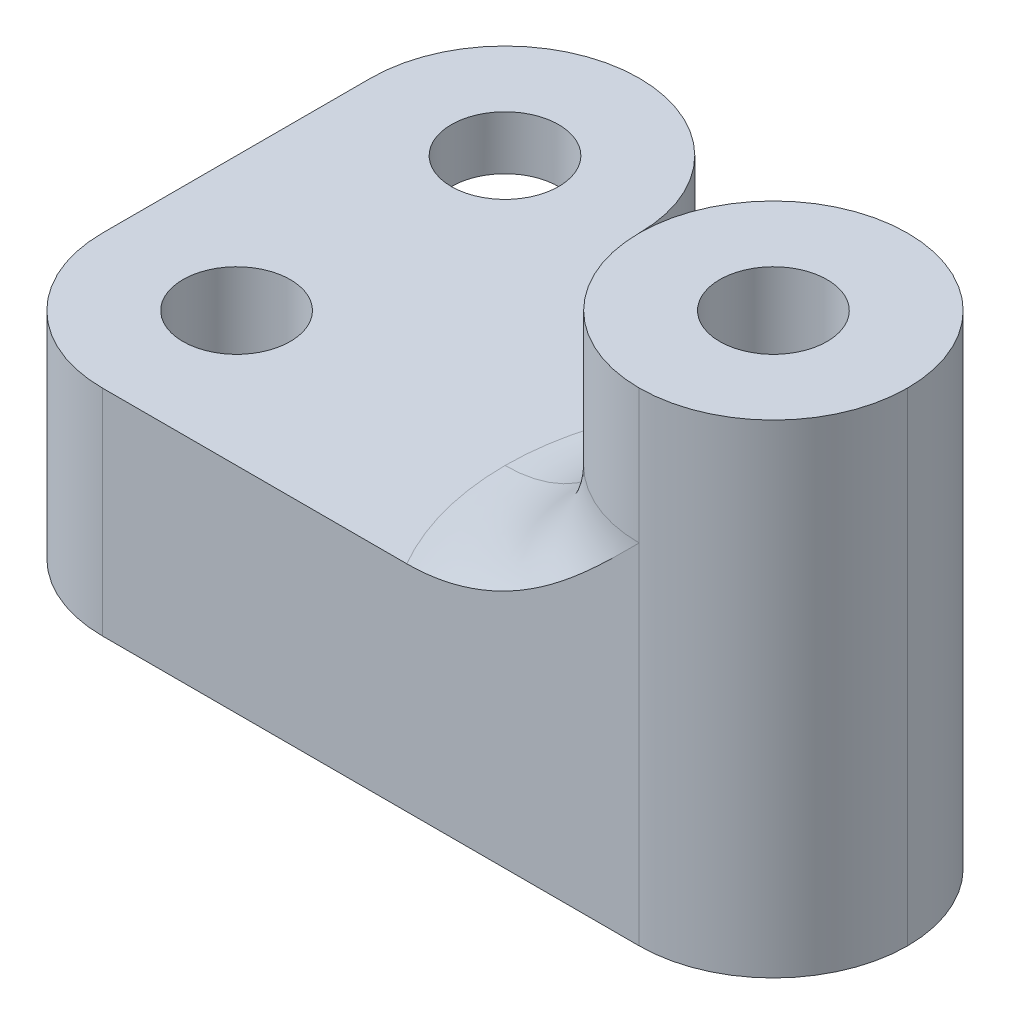
ISO-10303-21;
HEADER;
FILE_DESCRIPTION(('STEP AP214'),'2;1');
FILE_NAME('part.step','',(''),(''),'','','');
FILE_SCHEMA(('AUTOMOTIVE_DESIGN { 1 0 10303 214 1 1 1 1 }'));
ENDSEC;
DATA;
#1=APPLICATION_CONTEXT('core data for automotive mechanical design processes');
#2=APPLICATION_PROTOCOL_DEFINITION('international standard','automotive_design',2000,#1);
#3=PRODUCT_CONTEXT('',#1,'mechanical');
#4=PRODUCT('Part','Part','',(#3));
#5=PRODUCT_RELATED_PRODUCT_CATEGORY('part','',(#4));
#6=PRODUCT_DEFINITION_FORMATION('','',#4);
#7=PRODUCT_DEFINITION_CONTEXT('part definition',#1,'design');
#8=PRODUCT_DEFINITION('design','',#6,#7);
#9=PRODUCT_DEFINITION_SHAPE('','',#8);
#10=(LENGTH_UNIT() NAMED_UNIT(*) SI_UNIT(.MILLI.,.METRE.));
#11=(NAMED_UNIT(*) PLANE_ANGLE_UNIT() SI_UNIT($,.RADIAN.));
#12=(NAMED_UNIT(*) SI_UNIT($,.STERADIAN.) SOLID_ANGLE_UNIT());
#13=UNCERTAINTY_MEASURE_WITH_UNIT(LENGTH_MEASURE(1.E-05),#10,'distance_accuracy_value','');
#14=(GEOMETRIC_REPRESENTATION_CONTEXT(3) GLOBAL_UNCERTAINTY_ASSIGNED_CONTEXT((#13)) GLOBAL_UNIT_ASSIGNED_CONTEXT((#10,
#11,#12)) REPRESENTATION_CONTEXT('',''));
#15=CARTESIAN_POINT('',(0.,0.,0.));
#16=DIRECTION('',(0.,0.,1.));
#17=DIRECTION('',(1.,0.,0.));
#18=AXIS2_PLACEMENT_3D('',#15,#16,#17);
#19=CARTESIAN_POINT('',(2.5,-1.,-7.5));
#20=DIRECTION('',(0.,1.,0.));
#21=DIRECTION('',(0.,0.,1.));
#22=AXIS2_PLACEMENT_3D('',#19,#20,#21);
#23=CYLINDRICAL_SURFACE('',#22,1.);
#24=CARTESIAN_POINT('',(2.5,3.,-7.5));
#25=DIRECTION('',(0.,1.,0.));
#26=DIRECTION('',(-1.,0.,0.));
#27=AXIS2_PLACEMENT_3D('',#24,#25,#26);
#28=CIRCLE('',#27,1.);
#29=CARTESIAN_POINT('',(1.5,3.,-7.5));
#30=VERTEX_POINT('',#29);
#31=EDGE_CURVE('E208',#30,#30,#28,.F.);
#32=ORIENTED_EDGE('',*,*,#31,.T.);
#33=EDGE_LOOP('',(#32));
#34=FACE_BOUND('',#33,.T.);
#35=CARTESIAN_POINT('',(2.5,4.,-7.5));
#36=DIRECTION('',(0.,1.,0.));
#37=DIRECTION('',(0.,0.,1.));
#38=AXIS2_PLACEMENT_3D('',#35,#36,#37);
#39=CIRCLE('',#38,1.);
#40=CARTESIAN_POINT('',(2.5,4.,-6.5));
#41=VERTEX_POINT('',#40);
#42=EDGE_CURVE('E217',#41,#41,#39,.T.);
#43=ORIENTED_EDGE('',*,*,#42,.T.);
#44=EDGE_LOOP('',(#43));
#45=FACE_BOUND('',#44,.T.);
#46=ADVANCED_FACE('F44',(#34,#45),#23,.F.);
#47=CARTESIAN_POINT('',(0.,4.,0.));
#48=DIRECTION('',(0.,-1.,0.));
#49=DIRECTION('',(0.,0.,-1.));
#50=AXIS2_PLACEMENT_3D('',#47,#48,#49);
#51=PLANE('',#50);
#52=CARTESIAN_POINT('',(2.5,4.,-2.5));
#53=DIRECTION('',(0.,1.,0.));
#54=DIRECTION('',(0.,0.,1.));
#55=AXIS2_PLACEMENT_3D('',#52,#53,#54);
#56=CIRCLE('',#55,1.);
#57=CARTESIAN_POINT('',(2.5,4.,-1.5));
#58=VERTEX_POINT('',#57);
#59=EDGE_CURVE('E216',#58,#58,#56,.T.);
#60=ORIENTED_EDGE('',*,*,#59,.F.);
#61=EDGE_LOOP('',(#60));
#62=FACE_BOUND('',#61,.T.);
#63=ORIENTED_EDGE('',*,*,#42,.F.);
#64=EDGE_LOOP('',(#63));
#65=FACE_BOUND('',#64,.T.);
#66=CARTESIAN_POINT('',(12.5,4.,-2.5));
#67=DIRECTION('',(0.,-1.,0.));
#68=DIRECTION('',(0.,0.,-1.));
#69=AXIS2_PLACEMENT_3D('',#66,#67,#68);
#70=CIRCLE('',#69,5.);
#71=CARTESIAN_POINT('',(8.16987298107781,4.,0.));
#72=VERTEX_POINT('',#71);
#73=CARTESIAN_POINT('',(7.5,4.,-2.5));
#74=VERTEX_POINT('',#73);
#75=EDGE_CURVE('E343',#72,#74,#70,.T.);
#76=ORIENTED_EDGE('',*,*,#75,.T.);
#77=CARTESIAN_POINT('',(12.5,4.,-2.5));
#78=DIRECTION('',(0.,-1.,0.));
#79=DIRECTION('',(0.,0.,-1.));
#80=AXIS2_PLACEMENT_3D('',#77,#78,#79);
#81=CIRCLE('',#80,5.);
#82=CARTESIAN_POINT('',(8.16987298107781,4.,-5.));
#83=VERTEX_POINT('',#82);
#84=EDGE_CURVE('E375',#74,#83,#81,.T.);
#85=ORIENTED_EDGE('',*,*,#84,.T.);
#86=DIRECTION('',(-1.,0.,0.));
#87=VECTOR('',#86,1.);
#88=CARTESIAN_POINT('',(5.,4.,-5.));
#89=LINE('',#88,#87);
#90=CARTESIAN_POINT('',(7.5,4.,-5.));
#91=VERTEX_POINT('',#90);
#92=EDGE_CURVE('E229',#83,#91,#89,.T.);
#93=ORIENTED_EDGE('',*,*,#92,.T.);
#94=CARTESIAN_POINT('',(7.5,4.,-7.5));
#95=DIRECTION('',(0.,-1.,0.));
#96=DIRECTION('',(0.,0.,-1.));
#97=AXIS2_PLACEMENT_3D('',#94,#95,#96);
#98=CIRCLE('',#97,2.5);
#99=CARTESIAN_POINT('',(5.,4.,-7.5));
#100=VERTEX_POINT('',#99);
#101=EDGE_CURVE('E340',#91,#100,#98,.T.);
#102=ORIENTED_EDGE('',*,*,#101,.T.);
#103=CARTESIAN_POINT('',(2.5,4.,-7.5));
#104=DIRECTION('',(0.,-1.,0.));
#105=DIRECTION('',(0.,0.,-1.));
#106=AXIS2_PLACEMENT_3D('',#103,#104,#105);
#107=CIRCLE('',#106,2.5);
#108=CARTESIAN_POINT('',(2.5,4.,-10.));
#109=VERTEX_POINT('',#108);
#110=EDGE_CURVE('E292',#100,#109,#107,.F.);
#111=ORIENTED_EDGE('',*,*,#110,.T.);
#112=CARTESIAN_POINT('',(2.5,4.,-7.5));
#113=DIRECTION('',(0.,-1.,0.));
#114=DIRECTION('',(0.,0.,-1.));
#115=AXIS2_PLACEMENT_3D('',#112,#113,#114);
#116=CIRCLE('',#115,2.5);
#117=CARTESIAN_POINT('',(0.,4.,-7.5));
#118=VERTEX_POINT('',#117);
#119=EDGE_CURVE('E289',#109,#118,#116,.F.);
#120=ORIENTED_EDGE('',*,*,#119,.T.);
#121=DIRECTION('',(0.,0.,1.));
#122=VECTOR('',#121,1.);
#123=CARTESIAN_POINT('',(0.,4.,0.));
#124=LINE('',#123,#122);
#125=CARTESIAN_POINT('',(0.,4.,-2.5));
#126=VERTEX_POINT('',#125);
#127=EDGE_CURVE('E233',#118,#126,#124,.T.);
#128=ORIENTED_EDGE('',*,*,#127,.T.);
#129=CARTESIAN_POINT('',(2.5,4.,-2.5));
#130=DIRECTION('',(0.,-1.,0.));
#131=DIRECTION('',(0.,0.,-1.));
#132=AXIS2_PLACEMENT_3D('',#129,#130,#131);
#133=CIRCLE('',#132,2.5);
#134=CARTESIAN_POINT('',(2.5,4.,0.));
#135=VERTEX_POINT('',#134);
#136=EDGE_CURVE('E295',#126,#135,#133,.F.);
#137=ORIENTED_EDGE('',*,*,#136,.T.);
#138=DIRECTION('',(1.,0.,0.));
#139=VECTOR('',#138,1.);
#140=CARTESIAN_POINT('',(15.,4.,0.));
#141=LINE('',#140,#139);
#142=EDGE_CURVE('E225',#135,#72,#141,.T.);
#143=ORIENTED_EDGE('',*,*,#142,.T.);
#144=EDGE_LOOP('',(#76,#85,#93,#102,#111,#120,#128,#137,#143));
#145=FACE_BOUND('',#144,.T.);
#146=ADVANCED_FACE('F449',(#62,#65,#145),#51,.F.);
#147=CARTESIAN_POINT('',(15.,4.,0.));
#148=DIRECTION('',(0.,0.,-1.));
#149=DIRECTION('',(-1.,0.,0.));
#150=AXIS2_PLACEMENT_3D('',#147,#148,#149);
#151=PLANE('',#150);
#152=ORIENTED_EDGE('',*,*,#142,.F.);
#153=DIRECTION('',(0.,-1.,0.));
#154=VECTOR('',#153,1.);
#155=CARTESIAN_POINT('',(2.5,4.,0.));
#156=LINE('',#155,#154);
#157=CARTESIAN_POINT('',(2.5,0.,0.));
#158=VERTEX_POINT('',#157);
#159=EDGE_CURVE('E262',#135,#158,#156,.T.);
#160=ORIENTED_EDGE('',*,*,#159,.T.);
#161=DIRECTION('',(1.,0.,0.));
#162=VECTOR('',#161,1.);
#163=CARTESIAN_POINT('',(15.,0.,0.));
#164=LINE('',#163,#162);
#165=CARTESIAN_POINT('',(12.5,0.,0.));
#166=VERTEX_POINT('',#165);
#167=EDGE_CURVE('E237',#158,#166,#164,.T.);
#168=ORIENTED_EDGE('',*,*,#167,.T.);
#169=DIRECTION('',(0.,-1.,0.));
#170=VECTOR('',#169,1.);
#171=CARTESIAN_POINT('',(12.5,4.,0.));
#172=LINE('',#171,#170);
#173=CARTESIAN_POINT('',(12.5,6.5,0.));
#174=VERTEX_POINT('',#173);
#175=EDGE_CURVE('E61',#166,#174,#172,.F.);
#176=ORIENTED_EDGE('',*,*,#175,.T.);
#177=CARTESIAN_POINT('',(8.16987298107781,4.,0.));
#178=CARTESIAN_POINT('',(8.27699213765232,3.99998518822628,0.));
#179=CARTESIAN_POINT('',(8.38404869622634,4.00516117568163,0.));
#180=CARTESIAN_POINT('',(8.59709876023775,4.02518383038269,0.));
#181=CARTESIAN_POINT('',(8.70309363458557,4.04001578081046,0.));
#182=CARTESIAN_POINT('',(8.9121461196992,4.07841097755199,0.));
#183=CARTESIAN_POINT('',(9.01522373250462,4.10186688814086,0.));
#184=CARTESIAN_POINT('',(9.21925133017347,4.15679854268729,0.));
#185=CARTESIAN_POINT('',(9.32020027368209,4.18827811762926,0.));
#186=CARTESIAN_POINT('',(9.5565843663963,4.27155881264309,0.));
#187=CARTESIAN_POINT('',(9.6908947753359,4.32656450342293,0.));
#188=CARTESIAN_POINT('',(9.9541339862939,4.44830711980283,0.));
#189=CARTESIAN_POINT('',(10.0830583811296,4.51505342834353,0.));
#190=CARTESIAN_POINT('',(10.462501617266,4.73067190225553,0.));
#191=CARTESIAN_POINT('',(10.7045392055098,4.89448830853527,0.));
#192=CARTESIAN_POINT('',(11.2165518580896,5.28416937733512,0.));
#193=CARTESIAN_POINT('',(11.4819025558837,5.51585571962647,0.));
#194=CARTESIAN_POINT('',(11.9958369049188,5.99599504758528,0.));
#195=CARTESIAN_POINT('',(12.2444334034415,6.24443488717619,0.));
#196=CARTESIAN_POINT('',(12.4952859568563,6.49528595699774,0.));
#197=CARTESIAN_POINT('',(12.4976429794845,6.49764297964821,0.));
#198=CARTESIAN_POINT('',(12.5,6.5,0.));
#199=B_SPLINE_CURVE_WITH_KNOTS('',3,(#177,#178,#179,#180,#181,#182,#183,#184,#185,#186,#187,
#188,#189,#190,#191,#192,#193,#194,#195,#196,#197,#198),.UNSPECIFIED.,.F.,.F.,(4,2,2,2,2,2,2,2,
2,2,4),(0.,0.321140775587333,0.641793237301761,0.958582896209294,1.27552409399564,
1.71024159436257,2.1453081066917,3.0190883706329,4.07417999061932,5.12845312778747,
5.13845312779328),.UNSPECIFIED.);
#200=EDGE_CURVE('E11',#174,#72,#199,.F.);
#201=ORIENTED_EDGE('',*,*,#200,.T.);
#202=EDGE_LOOP('',(#152,#160,#168,#176,#201));
#203=FACE_BOUND('',#202,.T.);
#204=ADVANCED_FACE('F446',(#203),#151,.F.);
#205=CARTESIAN_POINT('',(5.,4.,-5.));
#206=DIRECTION('',(0.,0.,1.));
#207=DIRECTION('',(1.,0.,0.));
#208=AXIS2_PLACEMENT_3D('',#205,#206,#207);
#209=PLANE('',#208);
#210=ORIENTED_EDGE('',*,*,#92,.F.);
#211=CARTESIAN_POINT('',(8.16987298107781,4.,-5.));
#212=CARTESIAN_POINT('',(8.27699213765232,3.99998518822628,-5.));
#213=CARTESIAN_POINT('',(8.38404869622634,4.00516117568163,-5.));
#214=CARTESIAN_POINT('',(8.59709876023775,4.02518383038269,-5.));
#215=CARTESIAN_POINT('',(8.70309363458557,4.04001578081046,-5.));
#216=CARTESIAN_POINT('',(8.9121461196992,4.07841097755199,-5.));
#217=CARTESIAN_POINT('',(9.01522373250462,4.10186688814086,-5.));
#218=CARTESIAN_POINT('',(9.21925133017347,4.15679854268729,-5.));
#219=CARTESIAN_POINT('',(9.32020027368209,4.18827811762926,-5.));
#220=CARTESIAN_POINT('',(9.5565843663963,4.27155881264309,-5.));
#221=CARTESIAN_POINT('',(9.6908947753359,4.32656450342293,-5.));
#222=CARTESIAN_POINT('',(9.9541339862939,4.44830711980283,-5.));
#223=CARTESIAN_POINT('',(10.0830583811296,4.51505342834353,-5.));
#224=CARTESIAN_POINT('',(10.462501617266,4.73067190225553,-5.));
#225=CARTESIAN_POINT('',(10.7045392055098,4.89448830853527,-5.));
#226=CARTESIAN_POINT('',(11.2165518580896,5.28416937733512,-5.));
#227=CARTESIAN_POINT('',(11.4819025558837,5.51585571962647,-5.));
#228=CARTESIAN_POINT('',(11.9958369049188,5.99599504758528,-5.));
#229=CARTESIAN_POINT('',(12.2444334034415,6.24443488717619,-5.));
#230=CARTESIAN_POINT('',(12.4952859568563,6.49528595699774,-5.));
#231=CARTESIAN_POINT('',(12.4976429794845,6.49764297964821,-5.));
#232=CARTESIAN_POINT('',(12.5,6.5,-5.));
#233=B_SPLINE_CURVE_WITH_KNOTS('',3,(#211,#212,#213,#214,#215,#216,#217,#218,#219,#220,#221,
#222,#223,#224,#225,#226,#227,#228,#229,#230,#231,#232),.UNSPECIFIED.,.F.,.F.,(4,2,2,2,2,2,2,2,
2,2,4),(0.,0.321140775587333,0.641793237301761,0.958582896209294,1.27552409399564,
1.71024159436257,2.1453081066917,3.0190883706329,4.07417999061932,5.12845312778747,
5.13845312779328),.UNSPECIFIED.);
#234=CARTESIAN_POINT('',(12.5,6.5,-5.));
#235=VERTEX_POINT('',#234);
#236=EDGE_CURVE('E55',#83,#235,#233,.T.);
#237=ORIENTED_EDGE('',*,*,#236,.T.);
#238=DIRECTION('',(0.,-1.,0.));
#239=VECTOR('',#238,1.);
#240=CARTESIAN_POINT('',(12.5,4.,-5.));
#241=LINE('',#240,#239);
#242=CARTESIAN_POINT('',(12.5,0.,-5.));
#243=VERTEX_POINT('',#242);
#244=EDGE_CURVE('E317',#235,#243,#241,.T.);
#245=ORIENTED_EDGE('',*,*,#244,.T.);
#246=DIRECTION('',(-1.,0.,0.));
#247=VECTOR('',#246,1.);
#248=CARTESIAN_POINT('',(5.,0.,-5.));
#249=LINE('',#248,#247);
#250=CARTESIAN_POINT('',(7.5,0.,-5.));
#251=VERTEX_POINT('',#250);
#252=EDGE_CURVE('E240',#243,#251,#249,.T.);
#253=ORIENTED_EDGE('',*,*,#252,.T.);
#254=DIRECTION('',(0.,-1.,0.));
#255=VECTOR('',#254,1.);
#256=CARTESIAN_POINT('',(7.5,1.,-5.));
#257=LINE('',#256,#255);
#258=CARTESIAN_POINT('',(7.5,1.,-5.));
#259=VERTEX_POINT('',#258);
#260=EDGE_CURVE('E314',#251,#259,#257,.F.);
#261=ORIENTED_EDGE('',*,*,#260,.T.);
#262=DIRECTION('',(-1.,0.,0.));
#263=VECTOR('',#262,1.);
#264=CARTESIAN_POINT('',(0.,1.,-5.));
#265=LINE('',#264,#263);
#266=CARTESIAN_POINT('',(0.,1.,-5.));
#267=VERTEX_POINT('',#266);
#268=EDGE_CURVE('E178',#259,#267,#265,.T.);
#269=ORIENTED_EDGE('',*,*,#268,.T.);
#270=DIRECTION('',(0.,1.,0.));
#271=VECTOR('',#270,1.);
#272=CARTESIAN_POINT('',(0.,3.,-5.));
#273=LINE('',#272,#271);
#274=CARTESIAN_POINT('',(0.,3.,-5.));
#275=VERTEX_POINT('',#274);
#276=EDGE_CURVE('E170',#267,#275,#273,.T.);
#277=ORIENTED_EDGE('',*,*,#276,.T.);
#278=DIRECTION('',(1.,0.,0.));
#279=VECTOR('',#278,1.);
#280=CARTESIAN_POINT('',(0.,3.,-5.));
#281=LINE('',#280,#279);
#282=CARTESIAN_POINT('',(7.5,3.,-5.));
#283=VERTEX_POINT('',#282);
#284=EDGE_CURVE('E175',#275,#283,#281,.T.);
#285=ORIENTED_EDGE('',*,*,#284,.T.);
#286=DIRECTION('',(0.,-1.,0.));
#287=VECTOR('',#286,1.);
#288=CARTESIAN_POINT('',(7.5,4.,-5.));
#289=LINE('',#288,#287);
#290=EDGE_CURVE('E311',#283,#91,#289,.F.);
#291=ORIENTED_EDGE('',*,*,#290,.T.);
#292=EDGE_LOOP('',(#210,#237,#245,#253,#261,#269,#277,#285,#291));
#293=FACE_BOUND('',#292,.T.);
#294=ADVANCED_FACE('F173',(#293),#209,.F.);
#295=CARTESIAN_POINT('',(0.,4.,0.));
#296=DIRECTION('',(1.,0.,0.));
#297=DIRECTION('',(0.,0.,-1.));
#298=AXIS2_PLACEMENT_3D('',#295,#296,#297);
#299=PLANE('',#298);
#300=DIRECTION('',(0.,0.,1.));
#301=VECTOR('',#300,1.);
#302=CARTESIAN_POINT('',(0.,0.,0.));
#303=LINE('',#302,#301);
#304=CARTESIAN_POINT('',(0.,0.,-7.5));
#305=VERTEX_POINT('',#304);
#306=CARTESIAN_POINT('',(0.,0.,-2.5));
#307=VERTEX_POINT('',#306);
#308=EDGE_CURVE('E230',#305,#307,#303,.T.);
#309=ORIENTED_EDGE('',*,*,#308,.T.);
#310=DIRECTION('',(0.,-1.,0.));
#311=VECTOR('',#310,1.);
#312=CARTESIAN_POINT('',(0.,4.,-2.5));
#313=LINE('',#312,#311);
#314=EDGE_CURVE('E286',#307,#126,#313,.F.);
#315=ORIENTED_EDGE('',*,*,#314,.T.);
#316=ORIENTED_EDGE('',*,*,#127,.F.);
#317=DIRECTION('',(0.,-1.,0.));
#318=VECTOR('',#317,1.);
#319=CARTESIAN_POINT('',(0.,4.,-7.5));
#320=LINE('',#319,#318);
#321=CARTESIAN_POINT('',(0.,3.,-7.5));
#322=VERTEX_POINT('',#321);
#323=EDGE_CURVE('E201',#118,#322,#320,.T.);
#324=ORIENTED_EDGE('',*,*,#323,.T.);
#325=DIRECTION('',(0.,0.,-1.));
#326=VECTOR('',#325,1.);
#327=CARTESIAN_POINT('',(0.,3.,-5.));
#328=LINE('',#327,#326);
#329=EDGE_CURVE('E189',#275,#322,#328,.T.);
#330=ORIENTED_EDGE('',*,*,#329,.F.);
#331=ORIENTED_EDGE('',*,*,#276,.F.);
#332=DIRECTION('',(0.,0.,-1.));
#333=VECTOR('',#332,1.);
#334=CARTESIAN_POINT('',(0.,1.,-5.));
#335=LINE('',#334,#333);
#336=CARTESIAN_POINT('',(0.,1.,-7.5));
#337=VERTEX_POINT('',#336);
#338=EDGE_CURVE('E195',#267,#337,#335,.T.);
#339=ORIENTED_EDGE('',*,*,#338,.T.);
#340=DIRECTION('',(0.,-1.,0.));
#341=VECTOR('',#340,1.);
#342=CARTESIAN_POINT('',(0.,4.,-7.5));
#343=LINE('',#342,#341);
#344=EDGE_CURVE('E283',#337,#305,#343,.T.);
#345=ORIENTED_EDGE('',*,*,#344,.T.);
#346=EDGE_LOOP('',(#309,#315,#316,#324,#330,#331,#339,#345));
#347=FACE_BOUND('',#346,.T.);
#348=ADVANCED_FACE('F198',(#347),#299,.F.);
#349=CARTESIAN_POINT('',(0.,0.,0.));
#350=DIRECTION('',(0.,-1.,0.));
#351=DIRECTION('',(0.,0.,-1.));
#352=AXIS2_PLACEMENT_3D('',#349,#350,#351);
#353=PLANE('',#352);
#354=CARTESIAN_POINT('',(2.5,0.,-7.5));
#355=DIRECTION('',(0.,-1.,0.));
#356=DIRECTION('',(0.,0.,-1.));
#357=AXIS2_PLACEMENT_3D('',#354,#355,#356);
#358=CIRCLE('',#357,1.);
#359=CARTESIAN_POINT('',(2.5,0.,-8.5));
#360=VERTEX_POINT('',#359);
#361=EDGE_CURVE('E241',#360,#360,#358,.T.);
#362=ORIENTED_EDGE('',*,*,#361,.F.);
#363=EDGE_LOOP('',(#362));
#364=FACE_BOUND('',#363,.T.);
#365=CARTESIAN_POINT('',(2.5,0.,-2.5));
#366=DIRECTION('',(0.,-1.,0.));
#367=DIRECTION('',(0.,0.,-1.));
#368=AXIS2_PLACEMENT_3D('',#365,#366,#367);
#369=CIRCLE('',#368,1.);
#370=CARTESIAN_POINT('',(2.5,0.,-3.5));
#371=VERTEX_POINT('',#370);
#372=EDGE_CURVE('E250',#371,#371,#369,.T.);
#373=ORIENTED_EDGE('',*,*,#372,.F.);
#374=EDGE_LOOP('',(#373));
#375=FACE_BOUND('',#374,.T.);
#376=CARTESIAN_POINT('',(12.5,0.,-2.5));
#377=DIRECTION('',(0.,-1.,0.));
#378=DIRECTION('',(0.,0.,-1.));
#379=AXIS2_PLACEMENT_3D('',#376,#377,#378);
#380=CIRCLE('',#379,1.);
#381=CARTESIAN_POINT('',(12.5,0.,-3.5));
#382=VERTEX_POINT('',#381);
#383=EDGE_CURVE('E221',#382,#382,#380,.T.);
#384=ORIENTED_EDGE('',*,*,#383,.F.);
#385=EDGE_LOOP('',(#384));
#386=FACE_BOUND('',#385,.T.);
#387=ORIENTED_EDGE('',*,*,#167,.F.);
#388=CARTESIAN_POINT('',(2.5,0.,-2.5));
#389=DIRECTION('',(0.,-1.,0.));
#390=DIRECTION('',(0.,0.,-1.));
#391=AXIS2_PLACEMENT_3D('',#388,#389,#390);
#392=CIRCLE('',#391,2.5);
#393=EDGE_CURVE('E278',#158,#307,#392,.T.);
#394=ORIENTED_EDGE('',*,*,#393,.T.);
#395=ORIENTED_EDGE('',*,*,#308,.F.);
#396=CARTESIAN_POINT('',(2.5,0.,-7.5));
#397=DIRECTION('',(0.,-1.,0.));
#398=DIRECTION('',(0.,0.,-1.));
#399=AXIS2_PLACEMENT_3D('',#396,#397,#398);
#400=CIRCLE('',#399,2.5);
#401=CARTESIAN_POINT('',(2.5,0.,-10.));
#402=VERTEX_POINT('',#401);
#403=EDGE_CURVE('E269',#305,#402,#400,.T.);
#404=ORIENTED_EDGE('',*,*,#403,.T.);
#405=CARTESIAN_POINT('',(2.5,0.,-7.5));
#406=DIRECTION('',(0.,-1.,0.));
#407=DIRECTION('',(0.,0.,-1.));
#408=AXIS2_PLACEMENT_3D('',#405,#406,#407);
#409=CIRCLE('',#408,2.5);
#410=CARTESIAN_POINT('',(5.,0.,-7.5));
#411=VERTEX_POINT('',#410);
#412=EDGE_CURVE('E266',#402,#411,#409,.T.);
#413=ORIENTED_EDGE('',*,*,#412,.T.);
#414=CARTESIAN_POINT('',(7.5,0.,-7.5));
#415=DIRECTION('',(0.,-1.,0.));
#416=DIRECTION('',(0.,0.,-1.));
#417=AXIS2_PLACEMENT_3D('',#414,#415,#416);
#418=CIRCLE('',#417,2.5);
#419=EDGE_CURVE('E332',#411,#251,#418,.F.);
#420=ORIENTED_EDGE('',*,*,#419,.T.);
#421=ORIENTED_EDGE('',*,*,#252,.F.);
#422=CARTESIAN_POINT('',(12.5,0.,-2.5));
#423=DIRECTION('',(0.,-1.,0.));
#424=DIRECTION('',(0.,0.,-1.));
#425=AXIS2_PLACEMENT_3D('',#422,#423,#424);
#426=CIRCLE('',#425,2.5);
#427=CARTESIAN_POINT('',(15.,0.,-2.5));
#428=VERTEX_POINT('',#427);
#429=EDGE_CURVE('E272',#243,#428,#426,.T.);
#430=ORIENTED_EDGE('',*,*,#429,.T.);
#431=CARTESIAN_POINT('',(12.5,0.,-2.5));
#432=DIRECTION('',(0.,-1.,0.));
#433=DIRECTION('',(0.,0.,-1.));
#434=AXIS2_PLACEMENT_3D('',#431,#432,#433);
#435=CIRCLE('',#434,2.5);
#436=EDGE_CURVE('E275',#428,#166,#435,.T.);
#437=ORIENTED_EDGE('',*,*,#436,.T.);
#438=EDGE_LOOP('',(#387,#394,#395,#404,#413,#420,#421,#430,#437));
#439=FACE_BOUND('',#438,.T.);
#440=ADVANCED_FACE('F481',(#364,#375,#386,#439),#353,.T.);
#441=CARTESIAN_POINT('',(12.5,-1.,-2.5));
#442=DIRECTION('',(0.,1.,0.));
#443=DIRECTION('',(0.,0.,1.));
#444=AXIS2_PLACEMENT_3D('',#441,#442,#443);
#445=CYLINDRICAL_SURFACE('',#444,1.);
#446=ORIENTED_EDGE('',*,*,#383,.T.);
#447=EDGE_LOOP('',(#446));
#448=FACE_BOUND('',#447,.T.);
#449=CARTESIAN_POINT('',(12.5,9.,-2.5));
#450=DIRECTION('',(0.,1.,0.));
#451=DIRECTION('',(0.,0.,1.));
#452=AXIS2_PLACEMENT_3D('',#449,#450,#451);
#453=CIRCLE('',#452,1.);
#454=CARTESIAN_POINT('',(12.5,9.,-1.5));
#455=VERTEX_POINT('',#454);
#456=EDGE_CURVE('E212',#455,#455,#453,.T.);
#457=ORIENTED_EDGE('',*,*,#456,.T.);
#458=EDGE_LOOP('',(#457));
#459=FACE_BOUND('',#458,.T.);
#460=ADVANCED_FACE('F475',(#448,#459),#445,.F.);
#461=CARTESIAN_POINT('',(2.5,-1.,-2.5));
#462=DIRECTION('',(0.,1.,0.));
#463=DIRECTION('',(0.,0.,1.));
#464=AXIS2_PLACEMENT_3D('',#461,#462,#463);
#465=CYLINDRICAL_SURFACE('',#464,1.);
#466=ORIENTED_EDGE('',*,*,#372,.T.);
#467=EDGE_LOOP('',(#466));
#468=FACE_BOUND('',#467,.T.);
#469=ORIENTED_EDGE('',*,*,#59,.T.);
#470=EDGE_LOOP('',(#469));
#471=FACE_BOUND('',#470,.T.);
#472=ADVANCED_FACE('F468',(#468,#471),#465,.F.);
#473=CARTESIAN_POINT('',(2.5,1.,-7.5));
#474=DIRECTION('',(0.,-1.,0.));
#475=DIRECTION('',(0.,0.,-1.));
#476=AXIS2_PLACEMENT_3D('',#473,#474,#475);
#477=CIRCLE('',#476,1.);
#478=CARTESIAN_POINT('',(2.5,1.,-8.5));
#479=VERTEX_POINT('',#478);
#480=EDGE_CURVE('E203',#479,#479,#477,.F.);
#481=ORIENTED_EDGE('',*,*,#480,.T.);
#482=EDGE_LOOP('',(#481));
#483=FACE_BOUND('',#482,.T.);
#484=ORIENTED_EDGE('',*,*,#361,.T.);
#485=EDGE_LOOP('',(#484));
#486=FACE_BOUND('',#485,.T.);
#487=ADVANCED_FACE('F460',(#483,#486),#23,.F.);
#488=CARTESIAN_POINT('',(0.,9.,0.));
#489=DIRECTION('',(0.,1.,0.));
#490=DIRECTION('',(0.,0.,1.));
#491=AXIS2_PLACEMENT_3D('',#488,#489,#490);
#492=PLANE('',#491);
#493=CARTESIAN_POINT('',(12.5,9.,-2.5));
#494=DIRECTION('',(0.,1.,0.));
#495=DIRECTION('',(0.,0.,1.));
#496=AXIS2_PLACEMENT_3D('',#493,#494,#495);
#497=CIRCLE('',#496,2.5);
#498=CARTESIAN_POINT('',(12.5,9.,-5.));
#499=VERTEX_POINT('',#498);
#500=CARTESIAN_POINT('',(10.,9.,-2.5));
#501=VERTEX_POINT('',#500);
#502=EDGE_CURVE('E304',#499,#501,#497,.T.);
#503=ORIENTED_EDGE('',*,*,#502,.T.);
#504=CARTESIAN_POINT('',(12.5,9.,-2.5));
#505=DIRECTION('',(0.,1.,0.));
#506=DIRECTION('',(0.,0.,1.));
#507=AXIS2_PLACEMENT_3D('',#504,#505,#506);
#508=CIRCLE('',#507,2.5);
#509=CARTESIAN_POINT('',(12.5,9.,0.));
#510=VERTEX_POINT('',#509);
#511=EDGE_CURVE('E307',#501,#510,#508,.T.);
#512=ORIENTED_EDGE('',*,*,#511,.T.);
#513=CARTESIAN_POINT('',(12.5,9.,-2.5));
#514=DIRECTION('',(0.,1.,0.));
#515=DIRECTION('',(0.,0.,1.));
#516=AXIS2_PLACEMENT_3D('',#513,#514,#515);
#517=CIRCLE('',#516,2.5);
#518=CARTESIAN_POINT('',(15.,9.,-2.5));
#519=VERTEX_POINT('',#518);
#520=EDGE_CURVE('E301',#510,#519,#517,.T.);
#521=ORIENTED_EDGE('',*,*,#520,.T.);
#522=CARTESIAN_POINT('',(12.5,9.,-2.5));
#523=DIRECTION('',(0.,1.,0.));
#524=DIRECTION('',(0.,0.,1.));
#525=AXIS2_PLACEMENT_3D('',#522,#523,#524);
#526=CIRCLE('',#525,2.5);
#527=EDGE_CURVE('E298',#519,#499,#526,.T.);
#528=ORIENTED_EDGE('',*,*,#527,.T.);
#529=EDGE_LOOP('',(#503,#512,#521,#528));
#530=FACE_BOUND('',#529,.T.);
#531=ORIENTED_EDGE('',*,*,#456,.F.);
#532=EDGE_LOOP('',(#531));
#533=FACE_BOUND('',#532,.T.);
#534=ADVANCED_FACE('F467',(#530,#533),#492,.T.);
#535=CARTESIAN_POINT('',(0.,3.,-5.));
#536=DIRECTION('',(0.,1.,0.));
#537=DIRECTION('',(-1.,0.,0.));
#538=AXIS2_PLACEMENT_3D('',#535,#536,#537);
#539=PLANE('',#538);
#540=CARTESIAN_POINT('',(2.5,3.,-7.5));
#541=DIRECTION('',(0.,1.,0.));
#542=DIRECTION('',(-1.,0.,0.));
#543=AXIS2_PLACEMENT_3D('',#540,#541,#542);
#544=CIRCLE('',#543,2.5);
#545=CARTESIAN_POINT('',(2.5,3.,-10.));
#546=VERTEX_POINT('',#545);
#547=EDGE_CURVE('E326',#322,#546,#544,.F.);
#548=ORIENTED_EDGE('',*,*,#547,.T.);
#549=CARTESIAN_POINT('',(2.5,3.,-7.5));
#550=DIRECTION('',(0.,1.,0.));
#551=DIRECTION('',(-1.,0.,0.));
#552=AXIS2_PLACEMENT_3D('',#549,#550,#551);
#553=CIRCLE('',#552,2.5);
#554=CARTESIAN_POINT('',(5.,3.,-7.5));
#555=VERTEX_POINT('',#554);
#556=EDGE_CURVE('E329',#546,#555,#553,.F.);
#557=ORIENTED_EDGE('',*,*,#556,.T.);
#558=CARTESIAN_POINT('',(7.5,3.,-7.5));
#559=DIRECTION('',(0.,1.,0.));
#560=DIRECTION('',(-1.,0.,0.));
#561=AXIS2_PLACEMENT_3D('',#558,#559,#560);
#562=CIRCLE('',#561,2.5);
#563=EDGE_CURVE('E192',#555,#283,#562,.T.);
#564=ORIENTED_EDGE('',*,*,#563,.T.);
#565=ORIENTED_EDGE('',*,*,#284,.F.);
#566=ORIENTED_EDGE('',*,*,#329,.T.);
#567=EDGE_LOOP('',(#548,#557,#564,#565,#566));
#568=FACE_BOUND('',#567,.T.);
#569=ORIENTED_EDGE('',*,*,#31,.F.);
#570=EDGE_LOOP('',(#569));
#571=FACE_BOUND('',#570,.T.);
#572=ADVANCED_FACE('F187',(#568,#571),#539,.F.);
#573=CARTESIAN_POINT('',(0.,1.,-5.));
#574=DIRECTION('',(0.,-1.,0.));
#575=DIRECTION('',(0.,0.,-1.));
#576=AXIS2_PLACEMENT_3D('',#573,#574,#575);
#577=PLANE('',#576);
#578=CARTESIAN_POINT('',(2.5,1.,-7.5));
#579=DIRECTION('',(0.,-1.,0.));
#580=DIRECTION('',(0.,0.,-1.));
#581=AXIS2_PLACEMENT_3D('',#578,#579,#580);
#582=CIRCLE('',#581,2.5);
#583=CARTESIAN_POINT('',(5.,1.,-7.5));
#584=VERTEX_POINT('',#583);
#585=CARTESIAN_POINT('',(2.5,1.,-10.));
#586=VERTEX_POINT('',#585);
#587=EDGE_CURVE('E320',#584,#586,#582,.F.);
#588=ORIENTED_EDGE('',*,*,#587,.T.);
#589=CARTESIAN_POINT('',(2.5,1.,-7.5));
#590=DIRECTION('',(0.,-1.,0.));
#591=DIRECTION('',(0.,0.,-1.));
#592=AXIS2_PLACEMENT_3D('',#589,#590,#591);
#593=CIRCLE('',#592,2.5);
#594=EDGE_CURVE('E323',#586,#337,#593,.F.);
#595=ORIENTED_EDGE('',*,*,#594,.T.);
#596=ORIENTED_EDGE('',*,*,#338,.F.);
#597=ORIENTED_EDGE('',*,*,#268,.F.);
#598=CARTESIAN_POINT('',(7.5,1.,-7.5));
#599=DIRECTION('',(0.,-1.,0.));
#600=DIRECTION('',(0.,0.,-1.));
#601=AXIS2_PLACEMENT_3D('',#598,#599,#600);
#602=CIRCLE('',#601,2.5);
#603=EDGE_CURVE('E335',#259,#584,#602,.T.);
#604=ORIENTED_EDGE('',*,*,#603,.T.);
#605=EDGE_LOOP('',(#588,#595,#596,#597,#604));
#606=FACE_BOUND('',#605,.T.);
#607=ORIENTED_EDGE('',*,*,#480,.F.);
#608=EDGE_LOOP('',(#607));
#609=FACE_BOUND('',#608,.T.);
#610=ADVANCED_FACE('F444',(#606,#609),#577,.F.);
#611=CARTESIAN_POINT('',(2.5,4.,-2.5));
#612=DIRECTION('',(0.,-1.,0.));
#613=DIRECTION('',(0.,0.,-1.));
#614=AXIS2_PLACEMENT_3D('',#611,#612,#613);
#615=CYLINDRICAL_SURFACE('',#614,2.5);
#616=ORIENTED_EDGE('',*,*,#136,.F.);
#617=ORIENTED_EDGE('',*,*,#314,.F.);
#618=ORIENTED_EDGE('',*,*,#393,.F.);
#619=ORIENTED_EDGE('',*,*,#159,.F.);
#620=EDGE_LOOP('',(#616,#617,#618,#619));
#621=FACE_BOUND('',#620,.T.);
#622=ADVANCED_FACE('F432',(#621),#615,.T.);
#623=CARTESIAN_POINT('',(12.5,4.,-2.5));
#624=DIRECTION('',(0.,-1.,0.));
#625=DIRECTION('',(0.,0.,-1.));
#626=AXIS2_PLACEMENT_3D('',#623,#624,#625);
#627=CYLINDRICAL_SURFACE('',#626,2.5);
#628=ORIENTED_EDGE('',*,*,#429,.F.);
#629=ORIENTED_EDGE('',*,*,#244,.F.);
#630=DIRECTION('',(0.,-1.,0.));
#631=VECTOR('',#630,1.);
#632=CARTESIAN_POINT('',(12.5,4.,-5.));
#633=LINE('',#632,#631);
#634=EDGE_CURVE('E355',#499,#235,#633,.T.);
#635=ORIENTED_EDGE('',*,*,#634,.F.);
#636=ORIENTED_EDGE('',*,*,#527,.F.);
#637=DIRECTION('',(0.,-1.,0.));
#638=VECTOR('',#637,1.);
#639=CARTESIAN_POINT('',(15.,4.,-2.5));
#640=LINE('',#639,#638);
#641=EDGE_CURVE('E351',#428,#519,#640,.F.);
#642=ORIENTED_EDGE('',*,*,#641,.F.);
#643=EDGE_LOOP('',(#628,#629,#635,#636,#642));
#644=FACE_BOUND('',#643,.T.);
#645=ADVANCED_FACE('F428',(#644),#627,.T.);
#646=CARTESIAN_POINT('',(12.5,9.,-2.5));
#647=DIRECTION('',(0.,-1.,0.));
#648=DIRECTION('',(0.,0.,-1.));
#649=AXIS2_PLACEMENT_3D('',#646,#647,#648);
#650=CYLINDRICAL_SURFACE('',#649,2.5);
#651=ORIENTED_EDGE('',*,*,#634,.T.);
#652=CARTESIAN_POINT('',(12.5,6.5,-2.5));
#653=DIRECTION('',(0.,-1.,0.));
#654=DIRECTION('',(0.,0.,-1.));
#655=AXIS2_PLACEMENT_3D('',#652,#653,#654);
#656=CIRCLE('',#655,2.5);
#657=CARTESIAN_POINT('',(10.,6.5,-2.5));
#658=VERTEX_POINT('',#657);
#659=EDGE_CURVE('E69',#235,#658,#656,.F.);
#660=ORIENTED_EDGE('',*,*,#659,.T.);
#661=DIRECTION('',(0.,-1.,0.));
#662=VECTOR('',#661,1.);
#663=CARTESIAN_POINT('',(10.,9.,-2.5));
#664=LINE('',#663,#662);
#665=EDGE_CURVE('E347',#501,#658,#664,.T.);
#666=ORIENTED_EDGE('',*,*,#665,.F.);
#667=ORIENTED_EDGE('',*,*,#502,.F.);
#668=EDGE_LOOP('',(#651,#660,#666,#667));
#669=FACE_BOUND('',#668,.T.);
#670=ADVANCED_FACE('F431',(#669),#650,.T.);
#671=CARTESIAN_POINT('',(12.5,4.,-2.5));
#672=DIRECTION('',(0.,-1.,0.));
#673=DIRECTION('',(0.,0.,-1.));
#674=AXIS2_PLACEMENT_3D('',#671,#672,#673);
#675=CYLINDRICAL_SURFACE('',#674,2.5);
#676=ORIENTED_EDGE('',*,*,#641,.T.);
#677=ORIENTED_EDGE('',*,*,#520,.F.);
#678=DIRECTION('',(0.,-1.,0.));
#679=VECTOR('',#678,1.);
#680=CARTESIAN_POINT('',(12.5,4.,0.));
#681=LINE('',#680,#679);
#682=EDGE_CURVE('E344',#174,#510,#681,.F.);
#683=ORIENTED_EDGE('',*,*,#682,.F.);
#684=ORIENTED_EDGE('',*,*,#175,.F.);
#685=ORIENTED_EDGE('',*,*,#436,.F.);
#686=EDGE_LOOP('',(#676,#677,#683,#684,#685));
#687=FACE_BOUND('',#686,.T.);
#688=ADVANCED_FACE('F436',(#687),#675,.T.);
#689=CARTESIAN_POINT('',(12.5,4.,-2.5));
#690=DIRECTION('',(0.,-1.,0.));
#691=DIRECTION('',(0.,0.,-1.));
#692=AXIS2_PLACEMENT_3D('',#689,#690,#691);
#693=CYLINDRICAL_SURFACE('',#692,2.5);
#694=ORIENTED_EDGE('',*,*,#665,.T.);
#695=CARTESIAN_POINT('',(12.5,6.5,-2.5));
#696=DIRECTION('',(0.,-1.,0.));
#697=DIRECTION('',(0.,0.,-1.));
#698=AXIS2_PLACEMENT_3D('',#695,#696,#697);
#699=CIRCLE('',#698,2.5);
#700=EDGE_CURVE('E381',#658,#174,#699,.F.);
#701=ORIENTED_EDGE('',*,*,#700,.T.);
#702=ORIENTED_EDGE('',*,*,#682,.T.);
#703=ORIENTED_EDGE('',*,*,#511,.F.);
#704=EDGE_LOOP('',(#694,#701,#702,#703));
#705=FACE_BOUND('',#704,.T.);
#706=ADVANCED_FACE('F420',(#705),#693,.T.);
#707=CARTESIAN_POINT('',(2.5,4.,-7.5));
#708=DIRECTION('',(0.,-1.,0.));
#709=DIRECTION('',(0.,0.,-1.));
#710=AXIS2_PLACEMENT_3D('',#707,#708,#709);
#711=CYLINDRICAL_SURFACE('',#710,2.5);
#712=ORIENTED_EDGE('',*,*,#344,.F.);
#713=ORIENTED_EDGE('',*,*,#594,.F.);
#714=DIRECTION('',(0.,-1.,0.));
#715=VECTOR('',#714,1.);
#716=CARTESIAN_POINT('',(2.5,4.,-10.));
#717=LINE('',#716,#715);
#718=EDGE_CURVE('E348',#402,#586,#717,.F.);
#719=ORIENTED_EDGE('',*,*,#718,.F.);
#720=ORIENTED_EDGE('',*,*,#403,.F.);
#721=EDGE_LOOP('',(#712,#713,#719,#720));
#722=FACE_BOUND('',#721,.T.);
#723=ADVANCED_FACE('F416',(#722),#711,.T.);
#724=CARTESIAN_POINT('',(2.5,4.,-7.5));
#725=DIRECTION('',(0.,-1.,0.));
#726=DIRECTION('',(0.,0.,-1.));
#727=AXIS2_PLACEMENT_3D('',#724,#725,#726);
#728=CYLINDRICAL_SURFACE('',#727,2.5);
#729=ORIENTED_EDGE('',*,*,#718,.T.);
#730=ORIENTED_EDGE('',*,*,#587,.F.);
#731=DIRECTION('',(0.,-1.,0.));
#732=VECTOR('',#731,1.);
#733=CARTESIAN_POINT('',(5.,4.,-7.5));
#734=LINE('',#733,#732);
#735=EDGE_CURVE('E358',#411,#584,#734,.F.);
#736=ORIENTED_EDGE('',*,*,#735,.F.);
#737=ORIENTED_EDGE('',*,*,#412,.F.);
#738=EDGE_LOOP('',(#729,#730,#736,#737));
#739=FACE_BOUND('',#738,.T.);
#740=ADVANCED_FACE('F419',(#739),#728,.T.);
#741=CARTESIAN_POINT('',(7.5,4.,-7.5));
#742=DIRECTION('',(0.,1.,0.));
#743=DIRECTION('',(0.,0.,1.));
#744=AXIS2_PLACEMENT_3D('',#741,#742,#743);
#745=CYLINDRICAL_SURFACE('',#744,2.5);
#746=ORIENTED_EDGE('',*,*,#603,.F.);
#747=ORIENTED_EDGE('',*,*,#260,.F.);
#748=ORIENTED_EDGE('',*,*,#419,.F.);
#749=ORIENTED_EDGE('',*,*,#735,.T.);
#750=EDGE_LOOP('',(#746,#747,#748,#749));
#751=FACE_BOUND('',#750,.T.);
#752=ADVANCED_FACE('F407',(#751),#745,.F.);
#753=CARTESIAN_POINT('',(2.5,4.,-7.5));
#754=DIRECTION('',(0.,-1.,0.));
#755=DIRECTION('',(0.,0.,-1.));
#756=AXIS2_PLACEMENT_3D('',#753,#754,#755);
#757=CYLINDRICAL_SURFACE('',#756,2.5);
#758=ORIENTED_EDGE('',*,*,#323,.F.);
#759=ORIENTED_EDGE('',*,*,#119,.F.);
#760=DIRECTION('',(0.,-1.,0.));
#761=VECTOR('',#760,1.);
#762=CARTESIAN_POINT('',(2.5,4.,-10.));
#763=LINE('',#762,#761);
#764=EDGE_CURVE('E362',#546,#109,#763,.F.);
#765=ORIENTED_EDGE('',*,*,#764,.F.);
#766=ORIENTED_EDGE('',*,*,#547,.F.);
#767=EDGE_LOOP('',(#758,#759,#765,#766));
#768=FACE_BOUND('',#767,.T.);
#769=ADVANCED_FACE('F403',(#768),#757,.T.);
#770=CARTESIAN_POINT('',(2.5,4.,-7.5));
#771=DIRECTION('',(0.,-1.,0.));
#772=DIRECTION('',(0.,0.,-1.));
#773=AXIS2_PLACEMENT_3D('',#770,#771,#772);
#774=CYLINDRICAL_SURFACE('',#773,2.5);
#775=ORIENTED_EDGE('',*,*,#764,.T.);
#776=ORIENTED_EDGE('',*,*,#110,.F.);
#777=DIRECTION('',(0.,-1.,0.));
#778=VECTOR('',#777,1.);
#779=CARTESIAN_POINT('',(5.,4.,-7.5));
#780=LINE('',#779,#778);
#781=EDGE_CURVE('E366',#555,#100,#780,.F.);
#782=ORIENTED_EDGE('',*,*,#781,.F.);
#783=ORIENTED_EDGE('',*,*,#556,.F.);
#784=EDGE_LOOP('',(#775,#776,#782,#783));
#785=FACE_BOUND('',#784,.T.);
#786=ADVANCED_FACE('F406',(#785),#774,.T.);
#787=CARTESIAN_POINT('',(7.5,4.,-7.5));
#788=DIRECTION('',(0.,1.,0.));
#789=DIRECTION('',(0.,0.,1.));
#790=AXIS2_PLACEMENT_3D('',#787,#788,#789);
#791=CYLINDRICAL_SURFACE('',#790,2.5);
#792=ORIENTED_EDGE('',*,*,#101,.F.);
#793=ORIENTED_EDGE('',*,*,#290,.F.);
#794=ORIENTED_EDGE('',*,*,#563,.F.);
#795=ORIENTED_EDGE('',*,*,#781,.T.);
#796=EDGE_LOOP('',(#792,#793,#794,#795));
#797=FACE_BOUND('',#796,.T.);
#798=ADVANCED_FACE('F411',(#797),#791,.F.);
#799=CARTESIAN_POINT('',(12.5,6.5,-2.5));
#800=DIRECTION('',(0.,-1.,0.));
#801=DIRECTION('',(0.,0.,-1.));
#802=AXIS2_PLACEMENT_3D('',#799,#800,#801);
#803=TOROIDAL_SURFACE('',#802,5.,2.5);
#804=ORIENTED_EDGE('',*,*,#200,.F.);
#805=ORIENTED_EDGE('',*,*,#700,.F.);
#806=CARTESIAN_POINT('',(7.5,6.5,-2.5));
#807=DIRECTION('',(0.,0.,1.));
#808=DIRECTION('',(1.,0.,0.));
#809=AXIS2_PLACEMENT_3D('',#806,#807,#808);
#810=CIRCLE('',#809,2.5);
#811=EDGE_CURVE('E49',#74,#658,#810,.T.);
#812=ORIENTED_EDGE('',*,*,#811,.F.);
#813=ORIENTED_EDGE('',*,*,#75,.F.);
#814=EDGE_LOOP('',(#804,#805,#812,#813));
#815=FACE_BOUND('',#814,.T.);
#816=ADVANCED_FACE('F46',(#815),#803,.F.);
#817=CARTESIAN_POINT('',(12.5,6.5,-2.5));
#818=DIRECTION('',(0.,-1.,0.));
#819=DIRECTION('',(0.,0.,-1.));
#820=AXIS2_PLACEMENT_3D('',#817,#818,#819);
#821=TOROIDAL_SURFACE('',#820,5.,2.5);
#822=ORIENTED_EDGE('',*,*,#811,.T.);
#823=ORIENTED_EDGE('',*,*,#659,.F.);
#824=ORIENTED_EDGE('',*,*,#236,.F.);
#825=ORIENTED_EDGE('',*,*,#84,.F.);
#826=EDGE_LOOP('',(#822,#823,#824,#825));
#827=FACE_BOUND('',#826,.T.);
#828=ADVANCED_FACE('F398',(#827),#821,.F.);
#829=CLOSED_SHELL('',(#46,#146,#204,#294,#348,#440,#460,#472,#487,#534,#572,#610,#622,#645,#670,
#688,#706,#723,#740,#752,#769,#786,#798,#816,#828));
#830=MANIFOLD_SOLID_BREP('B2',#829);
#831=ADVANCED_BREP_SHAPE_REPRESENTATION('',(#18,#830),#14);
#832=SHAPE_DEFINITION_REPRESENTATION(#9,#831);
ENDSEC;
END-ISO-10303-21;
